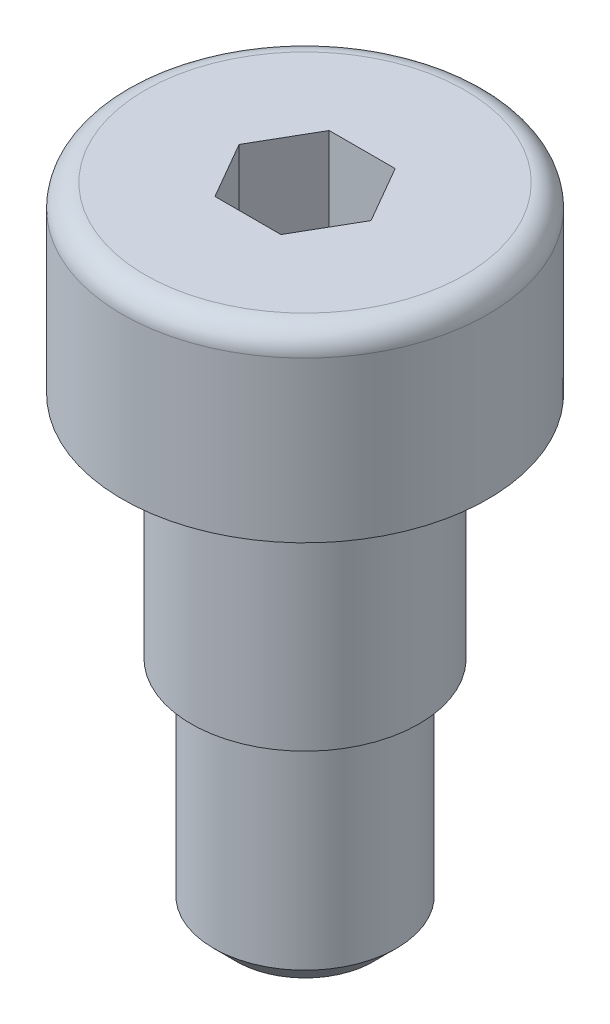
ISO-10303-21;
HEADER;
FILE_DESCRIPTION(('STEP AP214'),'2;1');
FILE_NAME('part.step','',(''),(''),'','','');
FILE_SCHEMA(('AUTOMOTIVE_DESIGN { 1 0 10303 214 1 1 1 1 }'));
ENDSEC;
DATA;
#1=APPLICATION_CONTEXT('core data for automotive mechanical design processes');
#2=APPLICATION_PROTOCOL_DEFINITION('international standard','automotive_design',2000,#1);
#3=PRODUCT_CONTEXT('',#1,'mechanical');
#4=PRODUCT('Part','Part','',(#3));
#5=PRODUCT_RELATED_PRODUCT_CATEGORY('part','',(#4));
#6=PRODUCT_DEFINITION_FORMATION('','',#4);
#7=PRODUCT_DEFINITION_CONTEXT('part definition',#1,'design');
#8=PRODUCT_DEFINITION('design','',#6,#7);
#9=PRODUCT_DEFINITION_SHAPE('','',#8);
#10=(LENGTH_UNIT() NAMED_UNIT(*) SI_UNIT(.MILLI.,.METRE.));
#11=(NAMED_UNIT(*) PLANE_ANGLE_UNIT() SI_UNIT($,.RADIAN.));
#12=(NAMED_UNIT(*) SI_UNIT($,.STERADIAN.) SOLID_ANGLE_UNIT());
#13=UNCERTAINTY_MEASURE_WITH_UNIT(LENGTH_MEASURE(1.E-05),#10,'distance_accuracy_value','');
#14=(GEOMETRIC_REPRESENTATION_CONTEXT(3) GLOBAL_UNCERTAINTY_ASSIGNED_CONTEXT((#13)) GLOBAL_UNIT_ASSIGNED_CONTEXT((#10,
#11,#12)) REPRESENTATION_CONTEXT('',''));
#15=CARTESIAN_POINT('',(0.,0.,0.));
#16=DIRECTION('',(0.,0.,1.));
#17=DIRECTION('',(1.,0.,0.));
#18=AXIS2_PLACEMENT_3D('',#15,#16,#17);
#19=CARTESIAN_POINT('',(0.,4.,0.));
#20=DIRECTION('',(0.,1.,0.));
#21=DIRECTION('',(-1.,0.,0.));
#22=AXIS2_PLACEMENT_3D('',#19,#20,#21);
#23=PLANE('',#22);
#24=DIRECTION('',(0.5,0.,-0.866025403784439));
#25=VECTOR('',#24,1.);
#26=CARTESIAN_POINT('',(0.721687836487032,4.,1.25));
#27=LINE('',#26,#25);
#28=CARTESIAN_POINT('',(0.721687836487032,4.,1.25));
#29=VERTEX_POINT('',#28);
#30=CARTESIAN_POINT('',(1.44337567297407,4.,0.));
#31=VERTEX_POINT('',#30);
#32=EDGE_CURVE('E44',#29,#31,#27,.T.);
#33=ORIENTED_EDGE('',*,*,#32,.F.);
#34=DIRECTION('',(1.,0.,0.));
#35=VECTOR('',#34,1.);
#36=CARTESIAN_POINT('',(-0.721687836487033,4.,1.25));
#37=LINE('',#36,#35);
#38=CARTESIAN_POINT('',(-0.721687836487033,4.,1.25));
#39=VERTEX_POINT('',#38);
#40=EDGE_CURVE('E127',#39,#29,#37,.T.);
#41=ORIENTED_EDGE('',*,*,#40,.F.);
#42=DIRECTION('',(0.5,0.,0.866025403784439));
#43=VECTOR('',#42,1.);
#44=CARTESIAN_POINT('',(-1.44337567297406,4.,0.));
#45=LINE('',#44,#43);
#46=CARTESIAN_POINT('',(-1.44337567297406,4.,0.));
#47=VERTEX_POINT('',#46);
#48=EDGE_CURVE('E125',#47,#39,#45,.T.);
#49=ORIENTED_EDGE('',*,*,#48,.F.);
#50=DIRECTION('',(-0.5,0.,0.866025403784439));
#51=VECTOR('',#50,1.);
#52=CARTESIAN_POINT('',(-0.721687836487032,4.,-1.25));
#53=LINE('',#52,#51);
#54=CARTESIAN_POINT('',(-0.721687836487032,4.,-1.25));
#55=VERTEX_POINT('',#54);
#56=EDGE_CURVE('E92',#55,#47,#53,.T.);
#57=ORIENTED_EDGE('',*,*,#56,.F.);
#58=DIRECTION('',(-1.,0.,0.));
#59=VECTOR('',#58,1.);
#60=CARTESIAN_POINT('',(0.721687836487033,4.,-1.25));
#61=LINE('',#60,#59);
#62=CARTESIAN_POINT('',(0.721687836487033,4.,-1.25));
#63=VERTEX_POINT('',#62);
#64=EDGE_CURVE('E121',#63,#55,#61,.T.);
#65=ORIENTED_EDGE('',*,*,#64,.F.);
#66=DIRECTION('',(-0.5,0.,-0.866025403784439));
#67=VECTOR('',#66,1.);
#68=CARTESIAN_POINT('',(1.44337567297406,4.,0.));
#69=LINE('',#68,#67);
#70=EDGE_CURVE('E118',#31,#63,#69,.T.);
#71=ORIENTED_EDGE('',*,*,#70,.F.);
#72=EDGE_LOOP('',(#33,#41,#49,#57,#65,#71));
#73=FACE_BOUND('',#72,.T.);
#74=CARTESIAN_POINT('',(0.,4.,0.));
#75=DIRECTION('',(0.,1.,0.));
#76=DIRECTION('',(-1.,0.,0.));
#77=AXIS2_PLACEMENT_3D('',#74,#75,#76);
#78=CIRCLE('',#77,3.5);
#79=CARTESIAN_POINT('',(-3.5,4.,0.));
#80=VERTEX_POINT('',#79);
#81=EDGE_CURVE('E11',#80,#80,#78,.T.);
#82=ORIENTED_EDGE('',*,*,#81,.T.);
#83=EDGE_LOOP('',(#82));
#84=FACE_BOUND('',#83,.T.);
#85=ADVANCED_FACE('F30',(#73,#84),#23,.T.);
#86=CARTESIAN_POINT('',(0.,3.5,0.));
#87=DIRECTION('',(0.,1.,0.));
#88=DIRECTION('',(-1.,0.,0.));
#89=AXIS2_PLACEMENT_3D('',#86,#87,#88);
#90=TOROIDAL_SURFACE('',#89,3.5,0.5);
#91=CARTESIAN_POINT('',(0.,3.5,0.));
#92=DIRECTION('',(0.,1.,0.));
#93=DIRECTION('',(-1.,0.,0.));
#94=AXIS2_PLACEMENT_3D('',#91,#92,#93);
#95=CIRCLE('',#94,4.);
#96=CARTESIAN_POINT('',(-4.,3.5,0.));
#97=VERTEX_POINT('',#96);
#98=EDGE_CURVE('E37',#97,#97,#95,.T.);
#99=ORIENTED_EDGE('',*,*,#98,.T.);
#100=EDGE_LOOP('',(#99));
#101=FACE_BOUND('',#100,.T.);
#102=ORIENTED_EDGE('',*,*,#81,.F.);
#103=EDGE_LOOP('',(#102));
#104=FACE_BOUND('',#103,.T.);
#105=ADVANCED_FACE('F156',(#101,#104),#90,.T.);
#106=CARTESIAN_POINT('',(0.,15.8257226222034,0.));
#107=DIRECTION('',(0.,1.,0.));
#108=DIRECTION('',(-1.,0.,0.));
#109=AXIS2_PLACEMENT_3D('',#106,#107,#108);
#110=CYLINDRICAL_SURFACE('',#109,4.);
#111=CARTESIAN_POINT('',(0.,0.,0.));
#112=DIRECTION('',(0.,1.,0.));
#113=DIRECTION('',(-1.,0.,0.));
#114=AXIS2_PLACEMENT_3D('',#111,#112,#113);
#115=CIRCLE('',#114,4.);
#116=CARTESIAN_POINT('',(-4.,0.,0.));
#117=VERTEX_POINT('',#116);
#118=EDGE_CURVE('E151',#117,#117,#115,.T.);
#119=ORIENTED_EDGE('',*,*,#118,.T.);
#120=EDGE_LOOP('',(#119));
#121=FACE_BOUND('',#120,.T.);
#122=ORIENTED_EDGE('',*,*,#98,.F.);
#123=EDGE_LOOP('',(#122));
#124=FACE_BOUND('',#123,.T.);
#125=ADVANCED_FACE('F159',(#121,#124),#110,.T.);
#126=CARTESIAN_POINT('',(-4.,0.,0.));
#127=DIRECTION('',(0.,-1.,0.));
#128=DIRECTION('',(1.,0.,0.));
#129=AXIS2_PLACEMENT_3D('',#126,#127,#128);
#130=PLANE('',#129);
#131=CARTESIAN_POINT('',(0.,0.,0.));
#132=DIRECTION('',(0.,1.,0.));
#133=DIRECTION('',(-1.,0.,0.));
#134=AXIS2_PLACEMENT_3D('',#131,#132,#133);
#135=CIRCLE('',#134,2.4935);
#136=CARTESIAN_POINT('',(-2.4935,0.,0.));
#137=VERTEX_POINT('',#136);
#138=EDGE_CURVE('E148',#137,#137,#135,.T.);
#139=ORIENTED_EDGE('',*,*,#138,.T.);
#140=EDGE_LOOP('',(#139));
#141=FACE_BOUND('',#140,.T.);
#142=ORIENTED_EDGE('',*,*,#118,.F.);
#143=EDGE_LOOP('',(#142));
#144=FACE_BOUND('',#143,.T.);
#145=ADVANCED_FACE('F161',(#141,#144),#130,.T.);
#146=CARTESIAN_POINT('',(0.,15.8257226222034,0.));
#147=DIRECTION('',(0.,1.,0.));
#148=DIRECTION('',(-1.,0.,0.));
#149=AXIS2_PLACEMENT_3D('',#146,#147,#148);
#150=CYLINDRICAL_SURFACE('',#149,2.4935);
#151=CARTESIAN_POINT('',(0.,-5.013,0.));
#152=DIRECTION('',(0.,1.,0.));
#153=DIRECTION('',(-1.,0.,0.));
#154=AXIS2_PLACEMENT_3D('',#151,#152,#153);
#155=CIRCLE('',#154,2.4935);
#156=CARTESIAN_POINT('',(-2.4935,-5.013,0.));
#157=VERTEX_POINT('',#156);
#158=EDGE_CURVE('E145',#157,#157,#155,.T.);
#159=ORIENTED_EDGE('',*,*,#158,.T.);
#160=EDGE_LOOP('',(#159));
#161=FACE_BOUND('',#160,.T.);
#162=ORIENTED_EDGE('',*,*,#138,.F.);
#163=EDGE_LOOP('',(#162));
#164=FACE_BOUND('',#163,.T.);
#165=ADVANCED_FACE('F168',(#161,#164),#150,.T.);
#166=CARTESIAN_POINT('',(-2.4935,-5.013,0.));
#167=DIRECTION('',(0.,-1.,0.));
#168=DIRECTION('',(1.,0.,0.));
#169=AXIS2_PLACEMENT_3D('',#166,#167,#168);
#170=PLANE('',#169);
#171=CARTESIAN_POINT('',(0.,-5.013,0.));
#172=DIRECTION('',(0.,1.,0.));
#173=DIRECTION('',(-1.,0.,0.));
#174=AXIS2_PLACEMENT_3D('',#171,#172,#173);
#175=CIRCLE('',#174,2.);
#176=CARTESIAN_POINT('',(-2.,-5.013,0.));
#177=VERTEX_POINT('',#176);
#178=EDGE_CURVE('E142',#177,#177,#175,.T.);
#179=ORIENTED_EDGE('',*,*,#178,.T.);
#180=EDGE_LOOP('',(#179));
#181=FACE_BOUND('',#180,.T.);
#182=ORIENTED_EDGE('',*,*,#158,.F.);
#183=EDGE_LOOP('',(#182));
#184=FACE_BOUND('',#183,.T.);
#185=ADVANCED_FACE('F205',(#181,#184),#170,.T.);
#186=CARTESIAN_POINT('',(0.,15.8257226222034,0.));
#187=DIRECTION('',(0.,1.,0.));
#188=DIRECTION('',(-1.,0.,0.));
#189=AXIS2_PLACEMENT_3D('',#186,#187,#188);
#190=CYLINDRICAL_SURFACE('',#189,2.);
#191=CARTESIAN_POINT('',(0.,-9.513,0.));
#192=DIRECTION('',(0.,1.,0.));
#193=DIRECTION('',(-1.,0.,0.));
#194=AXIS2_PLACEMENT_3D('',#191,#192,#193);
#195=CIRCLE('',#194,2.);
#196=CARTESIAN_POINT('',(-2.,-9.513,0.));
#197=VERTEX_POINT('',#196);
#198=EDGE_CURVE('E139',#197,#197,#195,.T.);
#199=ORIENTED_EDGE('',*,*,#198,.T.);
#200=EDGE_LOOP('',(#199));
#201=FACE_BOUND('',#200,.T.);
#202=ORIENTED_EDGE('',*,*,#178,.F.);
#203=EDGE_LOOP('',(#202));
#204=FACE_BOUND('',#203,.T.);
#205=ADVANCED_FACE('F201',(#201,#204),#190,.T.);
#206=CARTESIAN_POINT('',(0.,-9.513,0.));
#207=DIRECTION('',(0.,1.,0.));
#208=DIRECTION('',(-1.,0.,0.));
#209=AXIS2_PLACEMENT_3D('',#206,#207,#208);
#210=CONICAL_SURFACE('',#209,2.,0.785398163397448);
#211=CARTESIAN_POINT('',(0.,-10.013,0.));
#212=DIRECTION('',(0.,1.,0.));
#213=DIRECTION('',(-1.,0.,0.));
#214=AXIS2_PLACEMENT_3D('',#211,#212,#213);
#215=CIRCLE('',#214,1.5);
#216=CARTESIAN_POINT('',(-1.5,-10.013,0.));
#217=VERTEX_POINT('',#216);
#218=EDGE_CURVE('E131',#217,#217,#215,.T.);
#219=ORIENTED_EDGE('',*,*,#218,.T.);
#220=EDGE_LOOP('',(#219));
#221=FACE_BOUND('',#220,.T.);
#222=ORIENTED_EDGE('',*,*,#198,.F.);
#223=EDGE_LOOP('',(#222));
#224=FACE_BOUND('',#223,.T.);
#225=ADVANCED_FACE('F193',(#221,#224),#210,.T.);
#226=CARTESIAN_POINT('',(-1.5,-10.013,0.));
#227=DIRECTION('',(0.,-1.,0.));
#228=DIRECTION('',(1.,0.,0.));
#229=AXIS2_PLACEMENT_3D('',#226,#227,#228);
#230=PLANE('',#229);
#231=ORIENTED_EDGE('',*,*,#218,.F.);
#232=EDGE_LOOP('',(#231));
#233=FACE_BOUND('',#232,.T.);
#234=ADVANCED_FACE('F186',(#233),#230,.T.);
#235=CARTESIAN_POINT('',(0.721687836487033,2.,1.25));
#236=DIRECTION('',(0.866025403784439,0.,0.5));
#237=DIRECTION('',(0.5,0.,-0.866025403784439));
#238=AXIS2_PLACEMENT_3D('',#235,#236,#237);
#239=PLANE('',#238);
#240=ORIENTED_EDGE('',*,*,#32,.T.);
#241=DIRECTION('',(0.,1.,0.));
#242=VECTOR('',#241,1.);
#243=CARTESIAN_POINT('',(1.44337567297406,2.,0.));
#244=LINE('',#243,#242);
#245=CARTESIAN_POINT('',(1.44337567297406,2.,0.));
#246=VERTEX_POINT('',#245);
#247=EDGE_CURVE('E74',#246,#31,#244,.T.);
#248=ORIENTED_EDGE('',*,*,#247,.F.);
#249=DIRECTION('',(0.5,0.,-0.866025403784439));
#250=VECTOR('',#249,1.);
#251=CARTESIAN_POINT('',(0.721687836487033,2.,1.25));
#252=LINE('',#251,#250);
#253=CARTESIAN_POINT('',(0.721687836487033,2.,1.25));
#254=VERTEX_POINT('',#253);
#255=EDGE_CURVE('E129',#254,#246,#252,.T.);
#256=ORIENTED_EDGE('',*,*,#255,.F.);
#257=DIRECTION('',(0.,1.,0.));
#258=VECTOR('',#257,1.);
#259=CARTESIAN_POINT('',(0.721687836487033,2.,1.25));
#260=LINE('',#259,#258);
#261=EDGE_CURVE('E52',#254,#29,#260,.T.);
#262=ORIENTED_EDGE('',*,*,#261,.T.);
#263=EDGE_LOOP('',(#240,#248,#256,#262));
#264=FACE_BOUND('',#263,.T.);
#265=ADVANCED_FACE('F183',(#264),#239,.F.);
#266=CARTESIAN_POINT('',(-0.721687836487033,2.,1.25));
#267=DIRECTION('',(0.,0.,1.));
#268=DIRECTION('',(1.,0.,0.));
#269=AXIS2_PLACEMENT_3D('',#266,#267,#268);
#270=PLANE('',#269);
#271=ORIENTED_EDGE('',*,*,#40,.T.);
#272=ORIENTED_EDGE('',*,*,#261,.F.);
#273=DIRECTION('',(1.,0.,0.));
#274=VECTOR('',#273,1.);
#275=CARTESIAN_POINT('',(-0.721687836487033,2.,1.25));
#276=LINE('',#275,#274);
#277=CARTESIAN_POINT('',(-0.721687836487033,2.,1.25));
#278=VERTEX_POINT('',#277);
#279=EDGE_CURVE('E104',#278,#254,#276,.T.);
#280=ORIENTED_EDGE('',*,*,#279,.F.);
#281=DIRECTION('',(0.,1.,0.));
#282=VECTOR('',#281,1.);
#283=CARTESIAN_POINT('',(-0.721687836487033,2.,1.25));
#284=LINE('',#283,#282);
#285=EDGE_CURVE('E96',#278,#39,#284,.T.);
#286=ORIENTED_EDGE('',*,*,#285,.T.);
#287=EDGE_LOOP('',(#271,#272,#280,#286));
#288=FACE_BOUND('',#287,.T.);
#289=ADVANCED_FACE('F185',(#288),#270,.F.);
#290=CARTESIAN_POINT('',(-1.44337567297406,2.,0.));
#291=DIRECTION('',(-0.866025403784439,0.,0.5));
#292=DIRECTION('',(0.5,0.,0.866025403784439));
#293=AXIS2_PLACEMENT_3D('',#290,#291,#292);
#294=PLANE('',#293);
#295=ORIENTED_EDGE('',*,*,#48,.T.);
#296=ORIENTED_EDGE('',*,*,#285,.F.);
#297=DIRECTION('',(0.5,0.,0.866025403784439));
#298=VECTOR('',#297,1.);
#299=CARTESIAN_POINT('',(-1.44337567297406,2.,0.));
#300=LINE('',#299,#298);
#301=CARTESIAN_POINT('',(-1.44337567297406,2.,0.));
#302=VERTEX_POINT('',#301);
#303=EDGE_CURVE('E100',#302,#278,#300,.T.);
#304=ORIENTED_EDGE('',*,*,#303,.F.);
#305=DIRECTION('',(0.,1.,0.));
#306=VECTOR('',#305,1.);
#307=CARTESIAN_POINT('',(-1.44337567297406,2.,0.));
#308=LINE('',#307,#306);
#309=EDGE_CURVE('E85',#302,#47,#308,.T.);
#310=ORIENTED_EDGE('',*,*,#309,.T.);
#311=EDGE_LOOP('',(#295,#296,#304,#310));
#312=FACE_BOUND('',#311,.T.);
#313=ADVANCED_FACE('F101',(#312),#294,.F.);
#314=CARTESIAN_POINT('',(-0.721687836487031,2.,-1.25));
#315=DIRECTION('',(-0.866025403784439,0.,-0.5));
#316=DIRECTION('',(-0.5,0.,0.866025403784439));
#317=AXIS2_PLACEMENT_3D('',#314,#315,#316);
#318=PLANE('',#317);
#319=ORIENTED_EDGE('',*,*,#56,.T.);
#320=ORIENTED_EDGE('',*,*,#309,.F.);
#321=DIRECTION('',(-0.5,0.,0.866025403784439));
#322=VECTOR('',#321,1.);
#323=CARTESIAN_POINT('',(-0.721687836487031,2.,-1.25));
#324=LINE('',#323,#322);
#325=CARTESIAN_POINT('',(-0.721687836487031,2.,-1.25));
#326=VERTEX_POINT('',#325);
#327=EDGE_CURVE('E89',#326,#302,#324,.T.);
#328=ORIENTED_EDGE('',*,*,#327,.F.);
#329=DIRECTION('',(0.,1.,0.));
#330=VECTOR('',#329,1.);
#331=CARTESIAN_POINT('',(-0.721687836487031,2.,-1.25));
#332=LINE('',#331,#330);
#333=EDGE_CURVE('E97',#326,#55,#332,.T.);
#334=ORIENTED_EDGE('',*,*,#333,.T.);
#335=EDGE_LOOP('',(#319,#320,#328,#334));
#336=FACE_BOUND('',#335,.T.);
#337=ADVANCED_FACE('F87',(#336),#318,.F.);
#338=CARTESIAN_POINT('',(0.721687836487033,2.,-1.25));
#339=DIRECTION('',(0.,0.,-1.));
#340=DIRECTION('',(-1.,0.,0.));
#341=AXIS2_PLACEMENT_3D('',#338,#339,#340);
#342=PLANE('',#341);
#343=ORIENTED_EDGE('',*,*,#64,.T.);
#344=ORIENTED_EDGE('',*,*,#333,.F.);
#345=DIRECTION('',(-1.,0.,0.));
#346=VECTOR('',#345,1.);
#347=CARTESIAN_POINT('',(0.721687836487033,2.,-1.25));
#348=LINE('',#347,#346);
#349=CARTESIAN_POINT('',(0.721687836487033,2.,-1.25));
#350=VERTEX_POINT('',#349);
#351=EDGE_CURVE('E110',#350,#326,#348,.T.);
#352=ORIENTED_EDGE('',*,*,#351,.F.);
#353=DIRECTION('',(0.,1.,0.));
#354=VECTOR('',#353,1.);
#355=CARTESIAN_POINT('',(0.721687836487033,2.,-1.25));
#356=LINE('',#355,#354);
#357=EDGE_CURVE('E134',#350,#63,#356,.T.);
#358=ORIENTED_EDGE('',*,*,#357,.T.);
#359=EDGE_LOOP('',(#343,#344,#352,#358));
#360=FACE_BOUND('',#359,.T.);
#361=ADVANCED_FACE('F270',(#360),#342,.F.);
#362=CARTESIAN_POINT('',(1.44337567297406,2.,0.));
#363=DIRECTION('',(0.866025403784439,0.,-0.5));
#364=DIRECTION('',(-0.5,0.,-0.866025403784439));
#365=AXIS2_PLACEMENT_3D('',#362,#363,#364);
#366=PLANE('',#365);
#367=ORIENTED_EDGE('',*,*,#70,.T.);
#368=ORIENTED_EDGE('',*,*,#357,.F.);
#369=DIRECTION('',(-0.5,0.,-0.866025403784439));
#370=VECTOR('',#369,1.);
#371=CARTESIAN_POINT('',(1.44337567297406,2.,0.));
#372=LINE('',#371,#370);
#373=EDGE_CURVE('E112',#246,#350,#372,.T.);
#374=ORIENTED_EDGE('',*,*,#373,.F.);
#375=ORIENTED_EDGE('',*,*,#247,.T.);
#376=EDGE_LOOP('',(#367,#368,#374,#375));
#377=FACE_BOUND('',#376,.T.);
#378=ADVANCED_FACE('F181',(#377),#366,.F.);
#379=CARTESIAN_POINT('',(0.,2.,2.5));
#380=DIRECTION('',(0.,-1.,0.));
#381=DIRECTION('',(0.,0.,-1.));
#382=AXIS2_PLACEMENT_3D('',#379,#380,#381);
#383=PLANE('',#382);
#384=ORIENTED_EDGE('',*,*,#255,.T.);
#385=ORIENTED_EDGE('',*,*,#373,.T.);
#386=ORIENTED_EDGE('',*,*,#351,.T.);
#387=ORIENTED_EDGE('',*,*,#327,.T.);
#388=ORIENTED_EDGE('',*,*,#303,.T.);
#389=ORIENTED_EDGE('',*,*,#279,.T.);
#390=EDGE_LOOP('',(#384,#385,#386,#387,#388,#389));
#391=FACE_BOUND('',#390,.T.);
#392=ADVANCED_FACE('F107',(#391),#383,.F.);
#393=CLOSED_SHELL('',(#85,#105,#125,#145,#165,#185,#205,#225,#234,#265,#289,#313,#337,#361,#378,#392));
#394=MANIFOLD_SOLID_BREP('B2',#393);
#395=ADVANCED_BREP_SHAPE_REPRESENTATION('',(#18,#394),#14);
#396=SHAPE_DEFINITION_REPRESENTATION(#9,#395);
ENDSEC;
END-ISO-10303-21;
